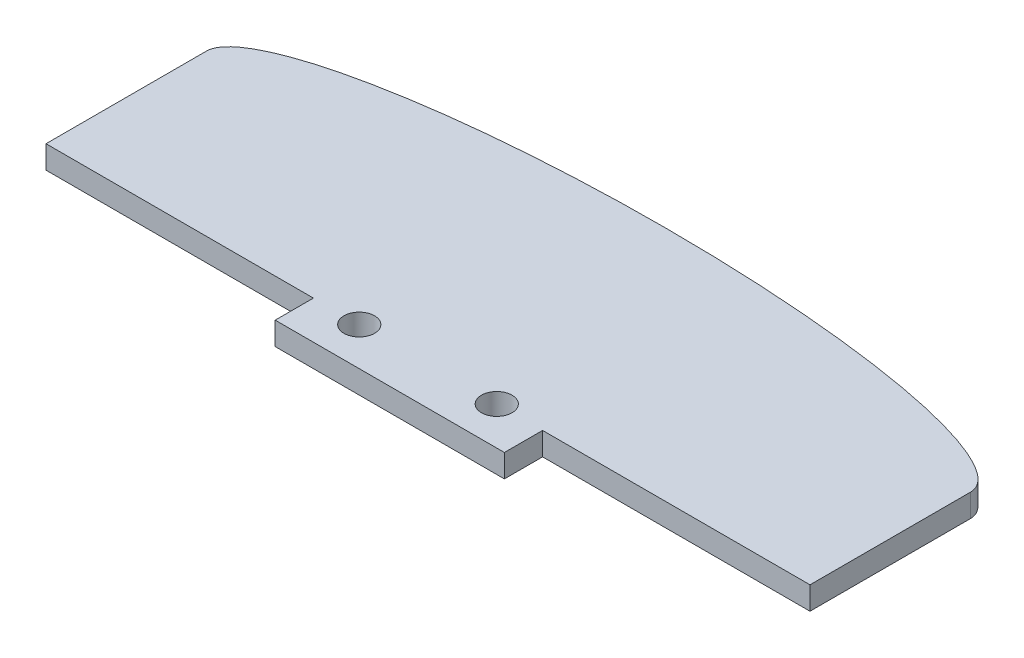
ISO-10303-21;
HEADER;
FILE_DESCRIPTION(('STEP AP214'),'2;1');
FILE_NAME('part.step','',(''),(''),'','','');
FILE_SCHEMA(('AUTOMOTIVE_DESIGN { 1 0 10303 214 1 1 1 1 }'));
ENDSEC;
DATA;
#1=APPLICATION_CONTEXT('core data for automotive mechanical design processes');
#2=APPLICATION_PROTOCOL_DEFINITION('international standard','automotive_design',2000,#1);
#3=PRODUCT_CONTEXT('',#1,'mechanical');
#4=PRODUCT('Part','Part','',(#3));
#5=PRODUCT_RELATED_PRODUCT_CATEGORY('part','',(#4));
#6=PRODUCT_DEFINITION_FORMATION('','',#4);
#7=PRODUCT_DEFINITION_CONTEXT('part definition',#1,'design');
#8=PRODUCT_DEFINITION('design','',#6,#7);
#9=PRODUCT_DEFINITION_SHAPE('','',#8);
#10=(LENGTH_UNIT() NAMED_UNIT(*) SI_UNIT(.MILLI.,.METRE.));
#11=(NAMED_UNIT(*) PLANE_ANGLE_UNIT() SI_UNIT($,.RADIAN.));
#12=(NAMED_UNIT(*) SI_UNIT($,.STERADIAN.) SOLID_ANGLE_UNIT());
#13=UNCERTAINTY_MEASURE_WITH_UNIT(LENGTH_MEASURE(1.E-05),#10,'distance_accuracy_value','');
#14=(GEOMETRIC_REPRESENTATION_CONTEXT(3) GLOBAL_UNCERTAINTY_ASSIGNED_CONTEXT((#13)) GLOBAL_UNIT_ASSIGNED_CONTEXT((#10,
#11,#12)) REPRESENTATION_CONTEXT('',''));
#15=CARTESIAN_POINT('',(0.,0.,0.));
#16=DIRECTION('',(0.,0.,1.));
#17=DIRECTION('',(1.,0.,0.));
#18=AXIS2_PLACEMENT_3D('',#15,#16,#17);
#19=CARTESIAN_POINT('',(0.,3.,-10.5000004408125));
#20=DIRECTION('',(0.,1.,0.));
#21=DIRECTION('',(0.,0.,1.));
#22=AXIS2_PLACEMENT_3D('',#19,#20,#21);
#23=PLANE('',#22);
#24=CARTESIAN_POINT('',(-9.,3.,10.5));
#25=DIRECTION('',(0.,1.,0.));
#26=DIRECTION('',(0.,0.,1.));
#27=AXIS2_PLACEMENT_3D('',#24,#25,#26);
#28=CIRCLE('',#27,2.);
#29=CARTESIAN_POINT('',(-9.,3.,12.5));
#30=VERTEX_POINT('',#29);
#31=EDGE_CURVE('E204',#30,#30,#28,.T.);
#32=ORIENTED_EDGE('',*,*,#31,.F.);
#33=EDGE_LOOP('',(#32));
#34=FACE_BOUND('',#33,.T.);
#35=DIRECTION('',(1.,0.,0.));
#36=VECTOR('',#35,1.);
#37=CARTESIAN_POINT('',(-15.,3.,10.5));
#38=LINE('',#37,#36);
#39=CARTESIAN_POINT('',(-50.,3.,10.5));
#40=VERTEX_POINT('',#39);
#41=CARTESIAN_POINT('',(-15.,3.,10.5));
#42=VERTEX_POINT('',#41);
#43=EDGE_CURVE('E212',#40,#42,#38,.T.);
#44=ORIENTED_EDGE('',*,*,#43,.T.);
#45=DIRECTION('',(0.,0.,1.));
#46=VECTOR('',#45,1.);
#47=CARTESIAN_POINT('',(-15.,3.,10.5));
#48=LINE('',#47,#46);
#49=CARTESIAN_POINT('',(-15.,3.,15.5));
#50=VERTEX_POINT('',#49);
#51=EDGE_CURVE('E104',#42,#50,#48,.T.);
#52=ORIENTED_EDGE('',*,*,#51,.T.);
#53=DIRECTION('',(1.,0.,0.));
#54=VECTOR('',#53,1.);
#55=CARTESIAN_POINT('',(-15.,3.,15.5));
#56=LINE('',#55,#54);
#57=CARTESIAN_POINT('',(15.,3.,15.5));
#58=VERTEX_POINT('',#57);
#59=EDGE_CURVE('E217',#50,#58,#56,.T.);
#60=ORIENTED_EDGE('',*,*,#59,.T.);
#61=DIRECTION('',(0.,0.,-1.));
#62=VECTOR('',#61,1.);
#63=CARTESIAN_POINT('',(15.,3.,15.5));
#64=LINE('',#63,#62);
#65=CARTESIAN_POINT('',(15.,3.,10.5));
#66=VERTEX_POINT('',#65);
#67=EDGE_CURVE('E220',#58,#66,#64,.T.);
#68=ORIENTED_EDGE('',*,*,#67,.T.);
#69=DIRECTION('',(1.,0.,0.));
#70=VECTOR('',#69,1.);
#71=CARTESIAN_POINT('',(50.,3.,10.5));
#72=LINE('',#71,#70);
#73=CARTESIAN_POINT('',(50.,3.,10.5));
#74=VERTEX_POINT('',#73);
#75=EDGE_CURVE('E123',#66,#74,#72,.T.);
#76=ORIENTED_EDGE('',*,*,#75,.T.);
#77=DIRECTION('',(0.,0.,-1.));
#78=VECTOR('',#77,1.);
#79=CARTESIAN_POINT('',(50.,3.,-10.5));
#80=LINE('',#79,#78);
#81=CARTESIAN_POINT('',(49.9999999999998,3.,-10.5));
#82=VERTEX_POINT('',#81);
#83=EDGE_CURVE('E117',#74,#82,#80,.T.);
#84=ORIENTED_EDGE('',*,*,#83,.T.);
#85=CARTESIAN_POINT('',(0.,3.,-10.5000004408125));
#86=DIRECTION('',(0.,1.,0.));
#87=DIRECTION('',(-1.,0.,8.81624957066451E-09));
#88=AXIS2_PLACEMENT_3D('',#85,#86,#87);
#89=ELLIPSE('',#88,50.,9.99999955918751);
#90=CARTESIAN_POINT('',(-50.,3.,-10.5));
#91=VERTEX_POINT('',#90);
#92=EDGE_CURVE('E121',#82,#91,#89,.T.);
#93=ORIENTED_EDGE('',*,*,#92,.T.);
#94=DIRECTION('',(0.,0.,1.));
#95=VECTOR('',#94,1.);
#96=CARTESIAN_POINT('',(-50.,3.,-10.5));
#97=LINE('',#96,#95);
#98=EDGE_CURVE('E61',#91,#40,#97,.T.);
#99=ORIENTED_EDGE('',*,*,#98,.T.);
#100=EDGE_LOOP('',(#44,#52,#60,#68,#76,#84,#93,#99));
#101=FACE_BOUND('',#100,.T.);
#102=CARTESIAN_POINT('',(9.,3.,10.5));
#103=DIRECTION('',(0.,1.,0.));
#104=DIRECTION('',(0.,0.,1.));
#105=AXIS2_PLACEMENT_3D('',#102,#103,#104);
#106=CIRCLE('',#105,2.);
#107=CARTESIAN_POINT('',(9.,3.,12.5));
#108=VERTEX_POINT('',#107);
#109=EDGE_CURVE('E193',#108,#108,#106,.T.);
#110=ORIENTED_EDGE('',*,*,#109,.F.);
#111=EDGE_LOOP('',(#110));
#112=FACE_BOUND('',#111,.T.);
#113=ADVANCED_FACE('F43',(#34,#101,#112),#23,.T.);
#114=CARTESIAN_POINT('',(0.,0.,-10.5000004408125));
#115=DIRECTION('',(0.,1.,0.));
#116=DIRECTION('',(0.,0.,1.));
#117=AXIS2_PLACEMENT_3D('',#114,#115,#116);
#118=PLANE('',#117);
#119=DIRECTION('',(1.,0.,0.));
#120=VECTOR('',#119,1.);
#121=CARTESIAN_POINT('',(-15.,0.,10.5));
#122=LINE('',#121,#120);
#123=CARTESIAN_POINT('',(-50.,0.,10.5));
#124=VERTEX_POINT('',#123);
#125=CARTESIAN_POINT('',(-15.,0.,10.5));
#126=VERTEX_POINT('',#125);
#127=EDGE_CURVE('E208',#124,#126,#122,.T.);
#128=ORIENTED_EDGE('',*,*,#127,.F.);
#129=DIRECTION('',(0.,0.,1.));
#130=VECTOR('',#129,1.);
#131=CARTESIAN_POINT('',(-50.,0.,-10.5));
#132=LINE('',#131,#130);
#133=CARTESIAN_POINT('',(-50.,0.,-10.5));
#134=VERTEX_POINT('',#133);
#135=EDGE_CURVE('E96',#134,#124,#132,.T.);
#136=ORIENTED_EDGE('',*,*,#135,.F.);
#137=CARTESIAN_POINT('',(0.,0.,-10.5000004408125));
#138=DIRECTION('',(0.,1.,0.));
#139=DIRECTION('',(-1.,0.,8.81624957066451E-09));
#140=AXIS2_PLACEMENT_3D('',#137,#138,#139);
#141=ELLIPSE('',#140,50.,9.99999955918751);
#142=CARTESIAN_POINT('',(49.9999999999998,0.,-10.5));
#143=VERTEX_POINT('',#142);
#144=EDGE_CURVE('E90',#143,#134,#141,.T.);
#145=ORIENTED_EDGE('',*,*,#144,.F.);
#146=DIRECTION('',(0.,0.,-1.));
#147=VECTOR('',#146,1.);
#148=CARTESIAN_POINT('',(50.,0.,-10.5));
#149=LINE('',#148,#147);
#150=CARTESIAN_POINT('',(50.,0.,10.5));
#151=VERTEX_POINT('',#150);
#152=EDGE_CURVE('E132',#151,#143,#149,.T.);
#153=ORIENTED_EDGE('',*,*,#152,.F.);
#154=DIRECTION('',(1.,0.,0.));
#155=VECTOR('',#154,1.);
#156=CARTESIAN_POINT('',(50.,0.,10.5));
#157=LINE('',#156,#155);
#158=CARTESIAN_POINT('',(15.,0.,10.5));
#159=VERTEX_POINT('',#158);
#160=EDGE_CURVE('E229',#159,#151,#157,.T.);
#161=ORIENTED_EDGE('',*,*,#160,.F.);
#162=DIRECTION('',(0.,0.,-1.));
#163=VECTOR('',#162,1.);
#164=CARTESIAN_POINT('',(15.,0.,15.5));
#165=LINE('',#164,#163);
#166=CARTESIAN_POINT('',(15.,0.,15.5));
#167=VERTEX_POINT('',#166);
#168=EDGE_CURVE('E232',#167,#159,#165,.T.);
#169=ORIENTED_EDGE('',*,*,#168,.F.);
#170=DIRECTION('',(1.,0.,0.));
#171=VECTOR('',#170,1.);
#172=CARTESIAN_POINT('',(-15.,0.,15.5));
#173=LINE('',#172,#171);
#174=CARTESIAN_POINT('',(-15.,0.,15.5));
#175=VERTEX_POINT('',#174);
#176=EDGE_CURVE('E235',#175,#167,#173,.T.);
#177=ORIENTED_EDGE('',*,*,#176,.F.);
#178=DIRECTION('',(0.,0.,1.));
#179=VECTOR('',#178,1.);
#180=CARTESIAN_POINT('',(-15.,0.,10.5));
#181=LINE('',#180,#179);
#182=EDGE_CURVE('E238',#126,#175,#181,.T.);
#183=ORIENTED_EDGE('',*,*,#182,.F.);
#184=EDGE_LOOP('',(#128,#136,#145,#153,#161,#169,#177,#183));
#185=FACE_BOUND('',#184,.T.);
#186=CARTESIAN_POINT('',(-9.,0.,10.5));
#187=DIRECTION('',(0.,1.,0.));
#188=DIRECTION('',(0.,0.,1.));
#189=AXIS2_PLACEMENT_3D('',#186,#187,#188);
#190=CIRCLE('',#189,2.);
#191=CARTESIAN_POINT('',(-9.,0.,12.5));
#192=VERTEX_POINT('',#191);
#193=EDGE_CURVE('E201',#192,#192,#190,.T.);
#194=ORIENTED_EDGE('',*,*,#193,.T.);
#195=EDGE_LOOP('',(#194));
#196=FACE_BOUND('',#195,.T.);
#197=CARTESIAN_POINT('',(9.,0.,10.5));
#198=DIRECTION('',(0.,1.,0.));
#199=DIRECTION('',(0.,0.,1.));
#200=AXIS2_PLACEMENT_3D('',#197,#198,#199);
#201=CIRCLE('',#200,2.);
#202=CARTESIAN_POINT('',(9.,0.,12.5));
#203=VERTEX_POINT('',#202);
#204=EDGE_CURVE('E196',#203,#203,#201,.T.);
#205=ORIENTED_EDGE('',*,*,#204,.T.);
#206=EDGE_LOOP('',(#205));
#207=FACE_BOUND('',#206,.T.);
#208=ADVANCED_FACE('F170',(#185,#196,#207),#118,.F.);
#209=CARTESIAN_POINT('',(-15.,3.,10.5));
#210=DIRECTION('',(0.,0.,-1.));
#211=DIRECTION('',(-1.,0.,0.));
#212=AXIS2_PLACEMENT_3D('',#209,#210,#211);
#213=PLANE('',#212);
#214=ORIENTED_EDGE('',*,*,#127,.T.);
#215=DIRECTION('',(0.,-1.,0.));
#216=VECTOR('',#215,1.);
#217=CARTESIAN_POINT('',(-15.,3.,10.5));
#218=LINE('',#217,#216);
#219=EDGE_CURVE('E11',#42,#126,#218,.T.);
#220=ORIENTED_EDGE('',*,*,#219,.F.);
#221=ORIENTED_EDGE('',*,*,#43,.F.);
#222=DIRECTION('',(0.,-1.,0.));
#223=VECTOR('',#222,1.);
#224=CARTESIAN_POINT('',(-50.,3.,10.5));
#225=LINE('',#224,#223);
#226=EDGE_CURVE('E141',#40,#124,#225,.T.);
#227=ORIENTED_EDGE('',*,*,#226,.T.);
#228=EDGE_LOOP('',(#214,#220,#221,#227));
#229=FACE_BOUND('',#228,.T.);
#230=ADVANCED_FACE('F45',(#229),#213,.F.);
#231=CARTESIAN_POINT('',(-15.,3.,10.5));
#232=DIRECTION('',(1.,0.,0.));
#233=DIRECTION('',(0.,0.,-1.));
#234=AXIS2_PLACEMENT_3D('',#231,#232,#233);
#235=PLANE('',#234);
#236=ORIENTED_EDGE('',*,*,#182,.T.);
#237=DIRECTION('',(0.,-1.,0.));
#238=VECTOR('',#237,1.);
#239=CARTESIAN_POINT('',(-15.,3.,15.5));
#240=LINE('',#239,#238);
#241=EDGE_CURVE('E53',#50,#175,#240,.T.);
#242=ORIENTED_EDGE('',*,*,#241,.F.);
#243=ORIENTED_EDGE('',*,*,#51,.F.);
#244=ORIENTED_EDGE('',*,*,#219,.T.);
#245=EDGE_LOOP('',(#236,#242,#243,#244));
#246=FACE_BOUND('',#245,.T.);
#247=ADVANCED_FACE('F164',(#246),#235,.F.);
#248=CARTESIAN_POINT('',(-15.,3.,15.5));
#249=DIRECTION('',(0.,0.,-1.));
#250=DIRECTION('',(-1.,0.,0.));
#251=AXIS2_PLACEMENT_3D('',#248,#249,#250);
#252=PLANE('',#251);
#253=ORIENTED_EDGE('',*,*,#176,.T.);
#254=DIRECTION('',(0.,-1.,0.));
#255=VECTOR('',#254,1.);
#256=CARTESIAN_POINT('',(15.,3.,15.5));
#257=LINE('',#256,#255);
#258=EDGE_CURVE('E256',#58,#167,#257,.T.);
#259=ORIENTED_EDGE('',*,*,#258,.F.);
#260=ORIENTED_EDGE('',*,*,#59,.F.);
#261=ORIENTED_EDGE('',*,*,#241,.T.);
#262=EDGE_LOOP('',(#253,#259,#260,#261));
#263=FACE_BOUND('',#262,.T.);
#264=ADVANCED_FACE('F161',(#263),#252,.F.);
#265=CARTESIAN_POINT('',(15.,3.,15.5));
#266=DIRECTION('',(-1.,0.,0.));
#267=DIRECTION('',(0.,0.,1.));
#268=AXIS2_PLACEMENT_3D('',#265,#266,#267);
#269=PLANE('',#268);
#270=ORIENTED_EDGE('',*,*,#168,.T.);
#271=DIRECTION('',(0.,-1.,0.));
#272=VECTOR('',#271,1.);
#273=CARTESIAN_POINT('',(15.,3.,10.5));
#274=LINE('',#273,#272);
#275=EDGE_CURVE('E252',#66,#159,#274,.T.);
#276=ORIENTED_EDGE('',*,*,#275,.F.);
#277=ORIENTED_EDGE('',*,*,#67,.F.);
#278=ORIENTED_EDGE('',*,*,#258,.T.);
#279=EDGE_LOOP('',(#270,#276,#277,#278));
#280=FACE_BOUND('',#279,.T.);
#281=ADVANCED_FACE('F157',(#280),#269,.F.);
#282=CARTESIAN_POINT('',(50.,3.,10.5));
#283=DIRECTION('',(0.,0.,-1.));
#284=DIRECTION('',(-1.,0.,0.));
#285=AXIS2_PLACEMENT_3D('',#282,#283,#284);
#286=PLANE('',#285);
#287=ORIENTED_EDGE('',*,*,#160,.T.);
#288=DIRECTION('',(0.,-1.,0.));
#289=VECTOR('',#288,1.);
#290=CARTESIAN_POINT('',(50.,3.,10.5));
#291=LINE('',#290,#289);
#292=EDGE_CURVE('E134',#74,#151,#291,.T.);
#293=ORIENTED_EDGE('',*,*,#292,.F.);
#294=ORIENTED_EDGE('',*,*,#75,.F.);
#295=ORIENTED_EDGE('',*,*,#275,.T.);
#296=EDGE_LOOP('',(#287,#293,#294,#295));
#297=FACE_BOUND('',#296,.T.);
#298=ADVANCED_FACE('F154',(#297),#286,.F.);
#299=CARTESIAN_POINT('',(50.,3.,-10.5));
#300=DIRECTION('',(-1.,0.,0.));
#301=DIRECTION('',(0.,0.,1.));
#302=AXIS2_PLACEMENT_3D('',#299,#300,#301);
#303=PLANE('',#302);
#304=ORIENTED_EDGE('',*,*,#152,.T.);
#305=DIRECTION('',(0.,-1.,0.));
#306=VECTOR('',#305,1.);
#307=CARTESIAN_POINT('',(49.9999999999998,3.,-10.5));
#308=LINE('',#307,#306);
#309=EDGE_CURVE('E129',#82,#143,#308,.T.);
#310=ORIENTED_EDGE('',*,*,#309,.F.);
#311=ORIENTED_EDGE('',*,*,#83,.F.);
#312=ORIENTED_EDGE('',*,*,#292,.T.);
#313=EDGE_LOOP('',(#304,#310,#311,#312));
#314=FACE_BOUND('',#313,.T.);
#315=ADVANCED_FACE('F130',(#314),#303,.F.);
#316=DIRECTION('',(0.,-1.,0.));
#317=VECTOR('',#316,1.);
#318=SURFACE_OF_LINEAR_EXTRUSION('',#89,#317);
#319=ORIENTED_EDGE('',*,*,#144,.T.);
#320=DIRECTION('',(0.,-1.,0.));
#321=VECTOR('',#320,1.);
#322=CARTESIAN_POINT('',(-50.,3.,-10.5));
#323=LINE('',#322,#321);
#324=EDGE_CURVE('E135',#91,#134,#323,.T.);
#325=ORIENTED_EDGE('',*,*,#324,.F.);
#326=ORIENTED_EDGE('',*,*,#92,.F.);
#327=ORIENTED_EDGE('',*,*,#309,.T.);
#328=EDGE_LOOP('',(#319,#325,#326,#327));
#329=FACE_BOUND('',#328,.T.);
#330=ADVANCED_FACE('F137',(#329),#318,.F.);
#331=CARTESIAN_POINT('',(-50.,3.,-10.5));
#332=DIRECTION('',(1.,0.,0.));
#333=DIRECTION('',(0.,0.,-1.));
#334=AXIS2_PLACEMENT_3D('',#331,#332,#333);
#335=PLANE('',#334);
#336=ORIENTED_EDGE('',*,*,#135,.T.);
#337=ORIENTED_EDGE('',*,*,#226,.F.);
#338=ORIENTED_EDGE('',*,*,#98,.F.);
#339=ORIENTED_EDGE('',*,*,#324,.T.);
#340=EDGE_LOOP('',(#336,#337,#338,#339));
#341=FACE_BOUND('',#340,.T.);
#342=ADVANCED_FACE('F150',(#341),#335,.F.);
#343=CARTESIAN_POINT('',(-9.,3.,10.5));
#344=DIRECTION('',(0.,-1.,0.));
#345=DIRECTION('',(0.,0.,-1.));
#346=AXIS2_PLACEMENT_3D('',#343,#344,#345);
#347=CYLINDRICAL_SURFACE('',#346,2.);
#348=ORIENTED_EDGE('',*,*,#31,.T.);
#349=EDGE_LOOP('',(#348));
#350=FACE_BOUND('',#349,.T.);
#351=ORIENTED_EDGE('',*,*,#193,.F.);
#352=EDGE_LOOP('',(#351));
#353=FACE_BOUND('',#352,.T.);
#354=ADVANCED_FACE('F181',(#350,#353),#347,.F.);
#355=CARTESIAN_POINT('',(9.,3.,10.5));
#356=DIRECTION('',(0.,-1.,0.));
#357=DIRECTION('',(0.,0.,-1.));
#358=AXIS2_PLACEMENT_3D('',#355,#356,#357);
#359=CYLINDRICAL_SURFACE('',#358,2.);
#360=ORIENTED_EDGE('',*,*,#109,.T.);
#361=EDGE_LOOP('',(#360));
#362=FACE_BOUND('',#361,.T.);
#363=ORIENTED_EDGE('',*,*,#204,.F.);
#364=EDGE_LOOP('',(#363));
#365=FACE_BOUND('',#364,.T.);
#366=ADVANCED_FACE('F184',(#362,#365),#359,.F.);
#367=CLOSED_SHELL('',(#113,#208,#230,#247,#264,#281,#298,#315,#330,#342,#354,#366));
#368=MANIFOLD_SOLID_BREP('B2',#367);
#369=ADVANCED_BREP_SHAPE_REPRESENTATION('',(#18,#368),#14);
#370=SHAPE_DEFINITION_REPRESENTATION(#9,#369);
ENDSEC;
END-ISO-10303-21;
